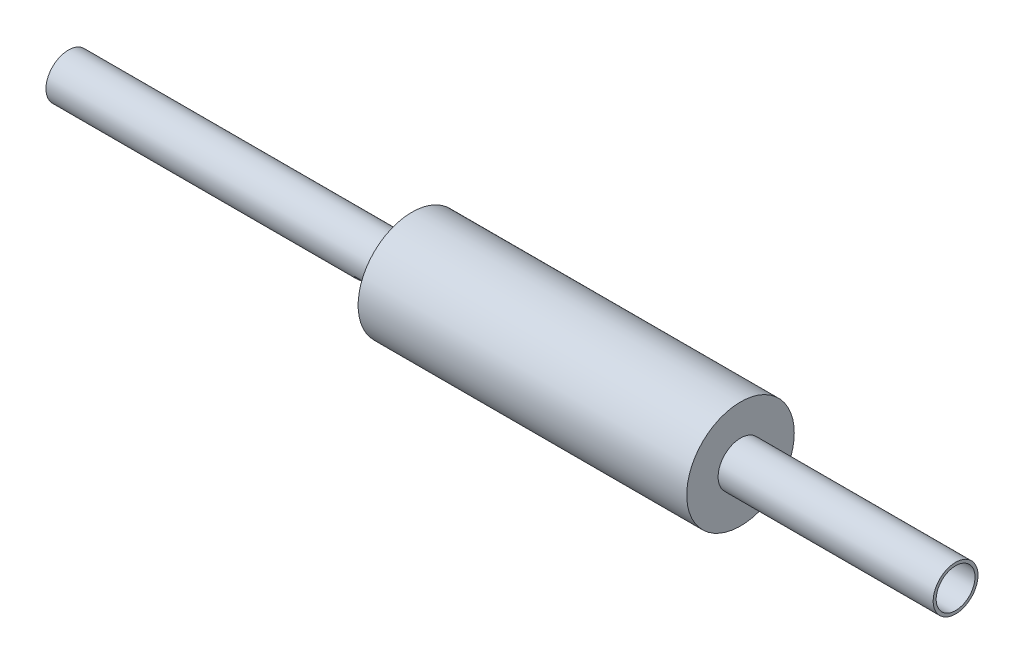
ISO-10303-21;
HEADER;
FILE_DESCRIPTION(('STEP AP214'),'2;1');
FILE_NAME('part.step','',(''),(''),'','','');
FILE_SCHEMA(('AUTOMOTIVE_DESIGN { 1 0 10303 214 1 1 1 1 }'));
ENDSEC;
DATA;
#1=APPLICATION_CONTEXT('core data for automotive mechanical design processes');
#2=APPLICATION_PROTOCOL_DEFINITION('international standard','automotive_design',2000,#1);
#3=PRODUCT_CONTEXT('',#1,'mechanical');
#4=PRODUCT('Part','Part','',(#3));
#5=PRODUCT_RELATED_PRODUCT_CATEGORY('part','',(#4));
#6=PRODUCT_DEFINITION_FORMATION('','',#4);
#7=PRODUCT_DEFINITION_CONTEXT('part definition',#1,'design');
#8=PRODUCT_DEFINITION('design','',#6,#7);
#9=PRODUCT_DEFINITION_SHAPE('','',#8);
#10=(LENGTH_UNIT() NAMED_UNIT(*) SI_UNIT(.MILLI.,.METRE.));
#11=(NAMED_UNIT(*) PLANE_ANGLE_UNIT() SI_UNIT($,.RADIAN.));
#12=(NAMED_UNIT(*) SI_UNIT($,.STERADIAN.) SOLID_ANGLE_UNIT());
#13=UNCERTAINTY_MEASURE_WITH_UNIT(LENGTH_MEASURE(1.E-05),#10,'distance_accuracy_value','');
#14=(GEOMETRIC_REPRESENTATION_CONTEXT(3) GLOBAL_UNCERTAINTY_ASSIGNED_CONTEXT((#13)) GLOBAL_UNIT_ASSIGNED_CONTEXT((#10,
#11,#12)) REPRESENTATION_CONTEXT('',''));
#15=CARTESIAN_POINT('',(0.,0.,0.));
#16=DIRECTION('',(0.,0.,1.));
#17=DIRECTION('',(1.,0.,0.));
#18=AXIS2_PLACEMENT_3D('',#15,#16,#17);
#19=CARTESIAN_POINT('',(55.,0.,0.));
#20=DIRECTION('',(-1.,0.,0.));
#21=DIRECTION('',(0.,0.,1.));
#22=AXIS2_PLACEMENT_3D('',#19,#20,#21);
#23=PLANE('',#22);
#24=CARTESIAN_POINT('',(55.,0.,0.));
#25=DIRECTION('',(1.,0.,0.));
#26=DIRECTION('',(0.,0.,-1.));
#27=AXIS2_PLACEMENT_3D('',#24,#25,#26);
#28=CIRCLE('',#27,7.5);
#29=CARTESIAN_POINT('',(55.,0.,-7.5));
#30=VERTEX_POINT('',#29);
#31=EDGE_CURVE('E115',#30,#30,#28,.T.);
#32=ORIENTED_EDGE('',*,*,#31,.F.);
#33=EDGE_LOOP('',(#32));
#34=FACE_BOUND('',#33,.T.);
#35=CARTESIAN_POINT('',(55.,0.,0.));
#36=DIRECTION('',(1.,0.,0.));
#37=DIRECTION('',(0.,0.,-1.));
#38=AXIS2_PLACEMENT_3D('',#35,#36,#37);
#39=CIRCLE('',#38,18.);
#40=CARTESIAN_POINT('',(55.,0.,-18.));
#41=VERTEX_POINT('',#40);
#42=EDGE_CURVE('E11',#41,#41,#39,.T.);
#43=ORIENTED_EDGE('',*,*,#42,.T.);
#44=EDGE_LOOP('',(#43));
#45=FACE_BOUND('',#44,.T.);
#46=ADVANCED_FACE('F37',(#34,#45),#23,.F.);
#47=CARTESIAN_POINT('',(196.356223273704,0.,0.));
#48=DIRECTION('',(1.,0.,0.));
#49=DIRECTION('',(0.,0.,-1.));
#50=AXIS2_PLACEMENT_3D('',#47,#48,#49);
#51=CYLINDRICAL_SURFACE('',#50,18.);
#52=ORIENTED_EDGE('',*,*,#42,.F.);
#53=EDGE_LOOP('',(#52));
#54=FACE_BOUND('',#53,.T.);
#55=CARTESIAN_POINT('',(-55.,0.,0.));
#56=DIRECTION('',(1.,0.,0.));
#57=DIRECTION('',(0.,0.,-1.));
#58=AXIS2_PLACEMENT_3D('',#55,#56,#57);
#59=CIRCLE('',#58,18.);
#60=CARTESIAN_POINT('',(-55.,0.,-18.));
#61=VERTEX_POINT('',#60);
#62=EDGE_CURVE('E44',#61,#61,#59,.T.);
#63=ORIENTED_EDGE('',*,*,#62,.T.);
#64=EDGE_LOOP('',(#63));
#65=FACE_BOUND('',#64,.T.);
#66=ADVANCED_FACE('F135',(#54,#65),#51,.T.);
#67=CARTESIAN_POINT('',(-55.,0.,0.));
#68=DIRECTION('',(-1.,0.,0.));
#69=DIRECTION('',(0.,0.,1.));
#70=AXIS2_PLACEMENT_3D('',#67,#68,#69);
#71=PLANE('',#70);
#72=CARTESIAN_POINT('',(-55.,0.,0.));
#73=DIRECTION('',(1.,0.,0.));
#74=DIRECTION('',(0.,0.,-1.));
#75=AXIS2_PLACEMENT_3D('',#72,#73,#74);
#76=CIRCLE('',#75,7.49999999999998);
#77=CARTESIAN_POINT('',(-55.,0.,-7.49999999999998));
#78=VERTEX_POINT('',#77);
#79=EDGE_CURVE('E130',#78,#78,#76,.T.);
#80=ORIENTED_EDGE('',*,*,#79,.T.);
#81=EDGE_LOOP('',(#80));
#82=FACE_BOUND('',#81,.T.);
#83=ORIENTED_EDGE('',*,*,#62,.F.);
#84=EDGE_LOOP('',(#83));
#85=FACE_BOUND('',#84,.T.);
#86=ADVANCED_FACE('F137',(#82,#85),#71,.T.);
#87=CARTESIAN_POINT('',(196.356223273704,0.,0.));
#88=DIRECTION('',(1.,0.,0.));
#89=DIRECTION('',(0.,0.,-1.));
#90=AXIS2_PLACEMENT_3D('',#87,#88,#89);
#91=CYLINDRICAL_SURFACE('',#90,7.5);
#92=CARTESIAN_POINT('',(-60.,0.,0.));
#93=DIRECTION('',(1.,0.,0.));
#94=DIRECTION('',(0.,0.,-1.));
#95=AXIS2_PLACEMENT_3D('',#92,#93,#94);
#96=CIRCLE('',#95,7.5);
#97=CARTESIAN_POINT('',(-60.,-3.74165738677397,6.5));
#98=VERTEX_POINT('',#97);
#99=CARTESIAN_POINT('',(-60.,-3.74165738677396,-6.5));
#100=VERTEX_POINT('',#99);
#101=EDGE_CURVE('E80',#98,#100,#96,.T.);
#102=ORIENTED_EDGE('',*,*,#101,.T.);
#103=DIRECTION('',(1.,0.,0.));
#104=VECTOR('',#103,1.);
#105=CARTESIAN_POINT('',(196.356223273704,-3.74165738677396,-6.5));
#106=LINE('',#105,#104);
#107=CARTESIAN_POINT('',(-68.,-3.74165738677396,-6.5));
#108=VERTEX_POINT('',#107);
#109=EDGE_CURVE('E83',#100,#108,#106,.F.);
#110=ORIENTED_EDGE('',*,*,#109,.T.);
#111=CARTESIAN_POINT('',(-68.,0.,0.));
#112=DIRECTION('',(-1.,0.,0.));
#113=DIRECTION('',(0.,0.,1.));
#114=AXIS2_PLACEMENT_3D('',#111,#112,#113);
#115=CIRCLE('',#114,7.5);
#116=CARTESIAN_POINT('',(-68.,-3.74165738677397,6.5));
#117=VERTEX_POINT('',#116);
#118=EDGE_CURVE('E99',#108,#117,#115,.T.);
#119=ORIENTED_EDGE('',*,*,#118,.T.);
#120=DIRECTION('',(1.,0.,0.));
#121=VECTOR('',#120,1.);
#122=CARTESIAN_POINT('',(196.356223273704,-3.74165738677397,6.5));
#123=LINE('',#122,#121);
#124=EDGE_CURVE('E103',#117,#98,#123,.T.);
#125=ORIENTED_EDGE('',*,*,#124,.T.);
#126=EDGE_LOOP('',(#102,#110,#119,#125));
#127=FACE_BOUND('',#126,.T.);
#128=CARTESIAN_POINT('',(-170.,0.,0.));
#129=DIRECTION('',(1.,0.,0.));
#130=DIRECTION('',(0.,0.,-1.));
#131=AXIS2_PLACEMENT_3D('',#128,#129,#130);
#132=CIRCLE('',#131,7.49999999999997);
#133=CARTESIAN_POINT('',(-170.,0.,-7.49999999999997));
#134=VERTEX_POINT('',#133);
#135=EDGE_CURVE('E127',#134,#134,#132,.T.);
#136=ORIENTED_EDGE('',*,*,#135,.T.);
#137=EDGE_LOOP('',(#136));
#138=FACE_BOUND('',#137,.T.);
#139=ORIENTED_EDGE('',*,*,#79,.F.);
#140=EDGE_LOOP('',(#139));
#141=FACE_BOUND('',#140,.T.);
#142=ADVANCED_FACE('F139',(#127,#138,#141),#91,.T.);
#143=CARTESIAN_POINT('',(-170.,0.,0.));
#144=DIRECTION('',(-1.,0.,0.));
#145=DIRECTION('',(0.,0.,1.));
#146=AXIS2_PLACEMENT_3D('',#143,#144,#145);
#147=PLANE('',#146);
#148=CARTESIAN_POINT('',(-170.,0.,0.));
#149=DIRECTION('',(1.,0.,0.));
#150=DIRECTION('',(0.,0.,-1.));
#151=AXIS2_PLACEMENT_3D('',#148,#149,#150);
#152=CIRCLE('',#151,6.49999999999997);
#153=CARTESIAN_POINT('',(-170.,0.,-6.49999999999997));
#154=VERTEX_POINT('',#153);
#155=EDGE_CURVE('E124',#154,#154,#152,.T.);
#156=ORIENTED_EDGE('',*,*,#155,.T.);
#157=EDGE_LOOP('',(#156));
#158=FACE_BOUND('',#157,.T.);
#159=ORIENTED_EDGE('',*,*,#135,.F.);
#160=EDGE_LOOP('',(#159));
#161=FACE_BOUND('',#160,.T.);
#162=ADVANCED_FACE('F146',(#158,#161),#147,.T.);
#163=CARTESIAN_POINT('',(196.356223273704,0.,0.));
#164=DIRECTION('',(1.,0.,0.));
#165=DIRECTION('',(0.,0.,-1.));
#166=AXIS2_PLACEMENT_3D('',#163,#164,#165);
#167=CYLINDRICAL_SURFACE('',#166,6.49999999999997);
#168=CARTESIAN_POINT('',(-60.,0.,0.));
#169=DIRECTION('',(1.,0.,0.));
#170=DIRECTION('',(0.,0.,-1.));
#171=AXIS2_PLACEMENT_3D('',#168,#169,#170);
#172=CIRCLE('',#171,6.49999999999997);
#173=CARTESIAN_POINT('',(-60.,0.,-6.49999999999999));
#174=VERTEX_POINT('',#173);
#175=CARTESIAN_POINT('',(-60.,0.,6.49999999999997));
#176=VERTEX_POINT('',#175);
#177=EDGE_CURVE('E59',#174,#176,#172,.F.);
#178=ORIENTED_EDGE('',*,*,#177,.T.);
#179=DIRECTION('',(1.,0.,0.));
#180=VECTOR('',#179,1.);
#181=CARTESIAN_POINT('',(-68.,0.,6.5));
#182=LINE('',#181,#180);
#183=CARTESIAN_POINT('',(-68.,0.,6.5));
#184=VERTEX_POINT('',#183);
#185=EDGE_CURVE('E87',#184,#176,#182,.T.);
#186=ORIENTED_EDGE('',*,*,#185,.F.);
#187=CARTESIAN_POINT('',(-68.,0.,0.));
#188=DIRECTION('',(-1.,0.,0.));
#189=DIRECTION('',(0.,0.,1.));
#190=AXIS2_PLACEMENT_3D('',#187,#188,#189);
#191=CIRCLE('',#190,6.49999999999997);
#192=CARTESIAN_POINT('',(-68.,0.,-6.5));
#193=VERTEX_POINT('',#192);
#194=EDGE_CURVE('E100',#184,#193,#191,.F.);
#195=ORIENTED_EDGE('',*,*,#194,.T.);
#196=DIRECTION('',(-1.,0.,0.));
#197=VECTOR('',#196,1.);
#198=CARTESIAN_POINT('',(-68.,0.,-6.5));
#199=LINE('',#198,#197);
#200=EDGE_CURVE('E94',#174,#193,#199,.T.);
#201=ORIENTED_EDGE('',*,*,#200,.F.);
#202=EDGE_LOOP('',(#178,#186,#195,#201));
#203=FACE_BOUND('',#202,.T.);
#204=CARTESIAN_POINT('',(127.,0.,0.));
#205=DIRECTION('',(1.,0.,0.));
#206=DIRECTION('',(0.,0.,-1.));
#207=AXIS2_PLACEMENT_3D('',#204,#205,#206);
#208=CIRCLE('',#207,6.49999999999997);
#209=CARTESIAN_POINT('',(127.,0.,-6.49999999999997));
#210=VERTEX_POINT('',#209);
#211=EDGE_CURVE('E121',#210,#210,#208,.T.);
#212=ORIENTED_EDGE('',*,*,#211,.T.);
#213=EDGE_LOOP('',(#212));
#214=FACE_BOUND('',#213,.T.);
#215=ORIENTED_EDGE('',*,*,#155,.F.);
#216=EDGE_LOOP('',(#215));
#217=FACE_BOUND('',#216,.T.);
#218=ADVANCED_FACE('F97',(#203,#214,#217),#167,.F.);
#219=CARTESIAN_POINT('',(127.,0.,0.));
#220=DIRECTION('',(-1.,0.,0.));
#221=DIRECTION('',(0.,0.,1.));
#222=AXIS2_PLACEMENT_3D('',#219,#220,#221);
#223=PLANE('',#222);
#224=ORIENTED_EDGE('',*,*,#211,.F.);
#225=EDGE_LOOP('',(#224));
#226=FACE_BOUND('',#225,.T.);
#227=CARTESIAN_POINT('',(127.,0.,0.));
#228=DIRECTION('',(1.,0.,0.));
#229=DIRECTION('',(0.,0.,-1.));
#230=AXIS2_PLACEMENT_3D('',#227,#228,#229);
#231=CIRCLE('',#230,7.50000000000001);
#232=CARTESIAN_POINT('',(127.,0.,-7.50000000000001));
#233=VERTEX_POINT('',#232);
#234=EDGE_CURVE('E118',#233,#233,#231,.T.);
#235=ORIENTED_EDGE('',*,*,#234,.T.);
#236=EDGE_LOOP('',(#235));
#237=FACE_BOUND('',#236,.T.);
#238=ADVANCED_FACE('F162',(#226,#237),#223,.F.);
#239=ORIENTED_EDGE('',*,*,#31,.T.);
#240=EDGE_LOOP('',(#239));
#241=FACE_BOUND('',#240,.T.);
#242=ORIENTED_EDGE('',*,*,#234,.F.);
#243=EDGE_LOOP('',(#242));
#244=FACE_BOUND('',#243,.T.);
#245=ADVANCED_FACE('F149',(#241,#244),#91,.T.);
#246=CARTESIAN_POINT('',(-60.,-18.001,6.5));
#247=DIRECTION('',(1.,0.,0.));
#248=DIRECTION('',(0.,0.,-1.));
#249=AXIS2_PLACEMENT_3D('',#246,#247,#248);
#250=PLANE('',#249);
#251=DIRECTION('',(0.,1.,0.));
#252=VECTOR('',#251,1.);
#253=CARTESIAN_POINT('',(-60.,-18.001,6.5));
#254=LINE('',#253,#252);
#255=EDGE_CURVE('E76',#98,#176,#254,.T.);
#256=ORIENTED_EDGE('',*,*,#255,.T.);
#257=ORIENTED_EDGE('',*,*,#177,.F.);
#258=DIRECTION('',(0.,1.,0.));
#259=VECTOR('',#258,1.);
#260=CARTESIAN_POINT('',(-60.,-18.001,-6.5));
#261=LINE('',#260,#259);
#262=EDGE_CURVE('E93',#100,#174,#261,.T.);
#263=ORIENTED_EDGE('',*,*,#262,.F.);
#264=ORIENTED_EDGE('',*,*,#101,.F.);
#265=EDGE_LOOP('',(#256,#257,#263,#264));
#266=FACE_BOUND('',#265,.T.);
#267=ADVANCED_FACE('F78',(#266),#250,.F.);
#268=CARTESIAN_POINT('',(-68.,-18.001,6.5));
#269=DIRECTION('',(0.,0.,1.));
#270=DIRECTION('',(1.,0.,0.));
#271=AXIS2_PLACEMENT_3D('',#268,#269,#270);
#272=PLANE('',#271);
#273=DIRECTION('',(0.,1.,0.));
#274=VECTOR('',#273,1.);
#275=CARTESIAN_POINT('',(-68.,-18.001,6.5));
#276=LINE('',#275,#274);
#277=EDGE_CURVE('E84',#117,#184,#276,.T.);
#278=ORIENTED_EDGE('',*,*,#277,.T.);
#279=ORIENTED_EDGE('',*,*,#185,.T.);
#280=ORIENTED_EDGE('',*,*,#255,.F.);
#281=ORIENTED_EDGE('',*,*,#124,.F.);
#282=EDGE_LOOP('',(#278,#279,#280,#281));
#283=FACE_BOUND('',#282,.T.);
#284=ADVANCED_FACE('F88',(#283),#272,.F.);
#285=CARTESIAN_POINT('',(-68.,-18.001,6.5));
#286=DIRECTION('',(-1.,0.,0.));
#287=DIRECTION('',(0.,0.,1.));
#288=AXIS2_PLACEMENT_3D('',#285,#286,#287);
#289=PLANE('',#288);
#290=DIRECTION('',(0.,1.,0.));
#291=VECTOR('',#290,1.);
#292=CARTESIAN_POINT('',(-68.,-18.001,-6.5));
#293=LINE('',#292,#291);
#294=EDGE_CURVE('E51',#108,#193,#293,.T.);
#295=ORIENTED_EDGE('',*,*,#294,.T.);
#296=ORIENTED_EDGE('',*,*,#194,.F.);
#297=ORIENTED_EDGE('',*,*,#277,.F.);
#298=ORIENTED_EDGE('',*,*,#118,.F.);
#299=EDGE_LOOP('',(#295,#296,#297,#298));
#300=FACE_BOUND('',#299,.T.);
#301=ADVANCED_FACE('F213',(#300),#289,.F.);
#302=CARTESIAN_POINT('',(-68.,-18.001,-6.5));
#303=DIRECTION('',(0.,0.,-1.));
#304=DIRECTION('',(-1.,0.,0.));
#305=AXIS2_PLACEMENT_3D('',#302,#303,#304);
#306=PLANE('',#305);
#307=ORIENTED_EDGE('',*,*,#262,.T.);
#308=ORIENTED_EDGE('',*,*,#200,.T.);
#309=ORIENTED_EDGE('',*,*,#294,.F.);
#310=ORIENTED_EDGE('',*,*,#109,.F.);
#311=EDGE_LOOP('',(#307,#308,#309,#310));
#312=FACE_BOUND('',#311,.T.);
#313=ADVANCED_FACE('F222',(#312),#306,.F.);
#314=CLOSED_SHELL('',(#46,#66,#86,#142,#162,#218,#238,#245,#267,#284,#301,#313));
#315=MANIFOLD_SOLID_BREP('B2',#314);
#316=ADVANCED_BREP_SHAPE_REPRESENTATION('',(#18,#315),#14);
#317=SHAPE_DEFINITION_REPRESENTATION(#9,#316);
ENDSEC;
END-ISO-10303-21;
